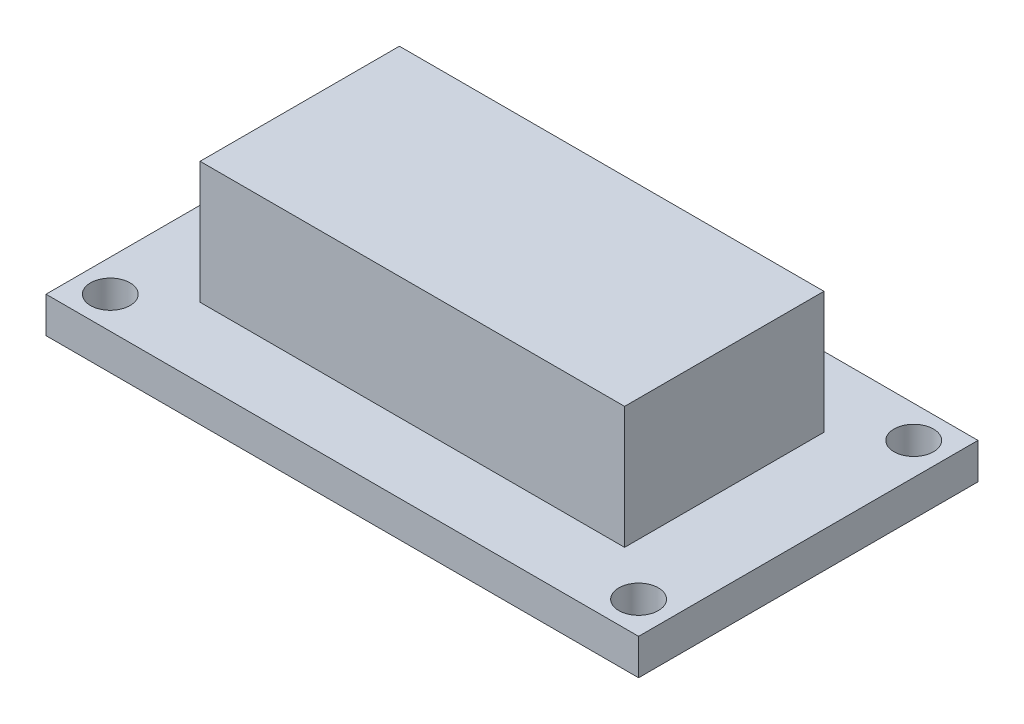
ISO-10303-21;
HEADER;
FILE_DESCRIPTION(('STEP AP214'),'2;1');
FILE_NAME('part.step','',(''),(''),'','','');
FILE_SCHEMA(('AUTOMOTIVE_DESIGN { 1 0 10303 214 1 1 1 1 }'));
ENDSEC;
DATA;
#1=APPLICATION_CONTEXT('core data for automotive mechanical design processes');
#2=APPLICATION_PROTOCOL_DEFINITION('international standard','automotive_design',2000,#1);
#3=PRODUCT_CONTEXT('',#1,'mechanical');
#4=PRODUCT('Part','Part','',(#3));
#5=PRODUCT_RELATED_PRODUCT_CATEGORY('part','',(#4));
#6=PRODUCT_DEFINITION_FORMATION('','',#4);
#7=PRODUCT_DEFINITION_CONTEXT('part definition',#1,'design');
#8=PRODUCT_DEFINITION('design','',#6,#7);
#9=PRODUCT_DEFINITION_SHAPE('','',#8);
#10=(LENGTH_UNIT() NAMED_UNIT(*) SI_UNIT(.MILLI.,.METRE.));
#11=(NAMED_UNIT(*) PLANE_ANGLE_UNIT() SI_UNIT($,.RADIAN.));
#12=(NAMED_UNIT(*) SI_UNIT($,.STERADIAN.) SOLID_ANGLE_UNIT());
#13=UNCERTAINTY_MEASURE_WITH_UNIT(LENGTH_MEASURE(1.E-05),#10,'distance_accuracy_value','');
#14=(GEOMETRIC_REPRESENTATION_CONTEXT(3) GLOBAL_UNCERTAINTY_ASSIGNED_CONTEXT((#13)) GLOBAL_UNIT_ASSIGNED_CONTEXT((#10,
#11,#12)) REPRESENTATION_CONTEXT('',''));
#15=CARTESIAN_POINT('',(0.,0.,0.));
#16=DIRECTION('',(0.,0.,1.));
#17=DIRECTION('',(1.,0.,0.));
#18=AXIS2_PLACEMENT_3D('',#15,#16,#17);
#19=CARTESIAN_POINT('',(0.,2.54,0.));
#20=DIRECTION('',(0.,-1.,0.));
#21=DIRECTION('',(0.,0.,-1.));
#22=AXIS2_PLACEMENT_3D('',#19,#20,#21);
#23=PLANE('',#22);
#24=CARTESIAN_POINT('',(18.6817,2.54,9.7282));
#25=DIRECTION('',(0.,1.,0.));
#26=DIRECTION('',(0.,0.,1.));
#27=AXIS2_PLACEMENT_3D('',#24,#25,#26);
#28=CIRCLE('',#27,1.397);
#29=CARTESIAN_POINT('',(18.6817,2.54,11.1252));
#30=VERTEX_POINT('',#29);
#31=EDGE_CURVE('E202',#30,#30,#28,.T.);
#32=ORIENTED_EDGE('',*,*,#31,.F.);
#33=EDGE_LOOP('',(#32));
#34=FACE_BOUND('',#33,.T.);
#35=CARTESIAN_POINT('',(-18.6817,2.54,-9.7282));
#36=DIRECTION('',(0.,1.,0.));
#37=DIRECTION('',(0.,0.,1.));
#38=AXIS2_PLACEMENT_3D('',#35,#36,#37);
#39=CIRCLE('',#38,1.397);
#40=CARTESIAN_POINT('',(-18.6817,2.54,-8.3312));
#41=VERTEX_POINT('',#40);
#42=EDGE_CURVE('E214',#41,#41,#39,.T.);
#43=ORIENTED_EDGE('',*,*,#42,.F.);
#44=EDGE_LOOP('',(#43));
#45=FACE_BOUND('',#44,.T.);
#46=DIRECTION('',(1.,0.,0.));
#47=VECTOR('',#46,1.);
#48=CARTESIAN_POINT('',(-20.955,2.54,-12.0015));
#49=LINE('',#48,#47);
#50=CARTESIAN_POINT('',(-20.955,2.54,-12.0015));
#51=VERTEX_POINT('',#50);
#52=CARTESIAN_POINT('',(20.955,2.54,-12.0015));
#53=VERTEX_POINT('',#52);
#54=EDGE_CURVE('E220',#51,#53,#49,.T.);
#55=ORIENTED_EDGE('',*,*,#54,.F.);
#56=DIRECTION('',(0.,0.,1.));
#57=VECTOR('',#56,1.);
#58=CARTESIAN_POINT('',(-20.955,2.54,-12.0015));
#59=LINE('',#58,#57);
#60=CARTESIAN_POINT('',(-20.955,2.54,12.0015));
#61=VERTEX_POINT('',#60);
#62=EDGE_CURVE('E229',#51,#61,#59,.T.);
#63=ORIENTED_EDGE('',*,*,#62,.T.);
#64=DIRECTION('',(1.,0.,0.));
#65=VECTOR('',#64,1.);
#66=CARTESIAN_POINT('',(-20.955,2.54,12.0015));
#67=LINE('',#66,#65);
#68=CARTESIAN_POINT('',(20.955,2.54,12.0015));
#69=VERTEX_POINT('',#68);
#70=EDGE_CURVE('E227',#61,#69,#67,.T.);
#71=ORIENTED_EDGE('',*,*,#70,.T.);
#72=DIRECTION('',(0.,0.,1.));
#73=VECTOR('',#72,1.);
#74=CARTESIAN_POINT('',(20.955,2.54,-12.0015));
#75=LINE('',#74,#73);
#76=EDGE_CURVE('E223',#53,#69,#75,.T.);
#77=ORIENTED_EDGE('',*,*,#76,.F.);
#78=EDGE_LOOP('',(#55,#63,#71,#77));
#79=FACE_BOUND('',#78,.T.);
#80=CARTESIAN_POINT('',(18.6817,2.54,-9.7282));
#81=DIRECTION('',(0.,-1.,0.));
#82=DIRECTION('',(0.,0.,-1.));
#83=AXIS2_PLACEMENT_3D('',#80,#81,#82);
#84=CIRCLE('',#83,1.397);
#85=CARTESIAN_POINT('',(18.6817,2.54,-11.1252));
#86=VERTEX_POINT('',#85);
#87=EDGE_CURVE('E208',#86,#86,#84,.T.);
#88=ORIENTED_EDGE('',*,*,#87,.T.);
#89=EDGE_LOOP('',(#88));
#90=FACE_BOUND('',#89,.T.);
#91=CARTESIAN_POINT('',(-18.6817,2.54,9.7282));
#92=DIRECTION('',(0.,-1.,0.));
#93=DIRECTION('',(0.,0.,-1.));
#94=AXIS2_PLACEMENT_3D('',#91,#92,#93);
#95=CIRCLE('',#94,1.397);
#96=CARTESIAN_POINT('',(-18.6817,2.54,8.3312));
#97=VERTEX_POINT('',#96);
#98=EDGE_CURVE('E193',#97,#97,#95,.T.);
#99=ORIENTED_EDGE('',*,*,#98,.T.);
#100=EDGE_LOOP('',(#99));
#101=FACE_BOUND('',#100,.T.);
#102=DIRECTION('',(0.,0.,-1.));
#103=VECTOR('',#102,1.);
#104=CARTESIAN_POINT('',(15.0114,2.54,-7.0485));
#105=LINE('',#104,#103);
#106=CARTESIAN_POINT('',(15.0114,2.54,7.0485));
#107=VERTEX_POINT('',#106);
#108=CARTESIAN_POINT('',(15.0114,2.54,-7.0485));
#109=VERTEX_POINT('',#108);
#110=EDGE_CURVE('E189',#107,#109,#105,.T.);
#111=ORIENTED_EDGE('',*,*,#110,.F.);
#112=DIRECTION('',(1.,0.,0.));
#113=VECTOR('',#112,1.);
#114=CARTESIAN_POINT('',(-15.0114,2.54,7.0485));
#115=LINE('',#114,#113);
#116=CARTESIAN_POINT('',(-15.0114,2.54,7.0485));
#117=VERTEX_POINT('',#116);
#118=EDGE_CURVE('E186',#117,#107,#115,.T.);
#119=ORIENTED_EDGE('',*,*,#118,.F.);
#120=DIRECTION('',(0.,0.,1.));
#121=VECTOR('',#120,1.);
#122=CARTESIAN_POINT('',(-15.0114,2.54,-7.0485));
#123=LINE('',#122,#121);
#124=CARTESIAN_POINT('',(-15.0114,2.54,-7.0485));
#125=VERTEX_POINT('',#124);
#126=EDGE_CURVE('E125',#125,#117,#123,.T.);
#127=ORIENTED_EDGE('',*,*,#126,.F.);
#128=DIRECTION('',(-1.,0.,0.));
#129=VECTOR('',#128,1.);
#130=CARTESIAN_POINT('',(-15.0114,2.54,-7.0485));
#131=LINE('',#130,#129);
#132=EDGE_CURVE('E120',#109,#125,#131,.T.);
#133=ORIENTED_EDGE('',*,*,#132,.F.);
#134=EDGE_LOOP('',(#111,#119,#127,#133));
#135=FACE_BOUND('',#134,.T.);
#136=ADVANCED_FACE('F103',(#34,#45,#79,#90,#101,#135),#23,.F.);
#137=CARTESIAN_POINT('',(0.,0.,0.));
#138=DIRECTION('',(0.,-1.,0.));
#139=DIRECTION('',(0.,0.,-1.));
#140=AXIS2_PLACEMENT_3D('',#137,#138,#139);
#141=PLANE('',#140);
#142=CARTESIAN_POINT('',(-18.6817,0.,9.7282));
#143=DIRECTION('',(0.,-1.,0.));
#144=DIRECTION('',(0.,0.,-1.));
#145=AXIS2_PLACEMENT_3D('',#142,#143,#144);
#146=CIRCLE('',#145,1.397);
#147=CARTESIAN_POINT('',(-18.6817,0.,8.3312));
#148=VERTEX_POINT('',#147);
#149=EDGE_CURVE('E190',#148,#148,#146,.T.);
#150=ORIENTED_EDGE('',*,*,#149,.F.);
#151=EDGE_LOOP('',(#150));
#152=FACE_BOUND('',#151,.T.);
#153=CARTESIAN_POINT('',(-18.6817,0.,-9.7282));
#154=DIRECTION('',(0.,1.,0.));
#155=DIRECTION('',(0.,0.,1.));
#156=AXIS2_PLACEMENT_3D('',#153,#154,#155);
#157=CIRCLE('',#156,1.397);
#158=CARTESIAN_POINT('',(-18.6817,0.,-8.3312));
#159=VERTEX_POINT('',#158);
#160=EDGE_CURVE('E211',#159,#159,#157,.T.);
#161=ORIENTED_EDGE('',*,*,#160,.T.);
#162=EDGE_LOOP('',(#161));
#163=FACE_BOUND('',#162,.T.);
#164=DIRECTION('',(1.,0.,0.));
#165=VECTOR('',#164,1.);
#166=CARTESIAN_POINT('',(-20.955,0.,-12.0015));
#167=LINE('',#166,#165);
#168=CARTESIAN_POINT('',(-20.955,0.,-12.0015));
#169=VERTEX_POINT('',#168);
#170=CARTESIAN_POINT('',(20.955,0.,-12.0015));
#171=VERTEX_POINT('',#170);
#172=EDGE_CURVE('E217',#169,#171,#167,.T.);
#173=ORIENTED_EDGE('',*,*,#172,.T.);
#174=DIRECTION('',(0.,0.,1.));
#175=VECTOR('',#174,1.);
#176=CARTESIAN_POINT('',(20.955,0.,-12.0015));
#177=LINE('',#176,#175);
#178=CARTESIAN_POINT('',(20.955,0.,12.0015));
#179=VERTEX_POINT('',#178);
#180=EDGE_CURVE('E233',#171,#179,#177,.T.);
#181=ORIENTED_EDGE('',*,*,#180,.T.);
#182=DIRECTION('',(1.,0.,0.));
#183=VECTOR('',#182,1.);
#184=CARTESIAN_POINT('',(-20.955,0.,12.0015));
#185=LINE('',#184,#183);
#186=CARTESIAN_POINT('',(-20.955,0.,12.0015));
#187=VERTEX_POINT('',#186);
#188=EDGE_CURVE('E236',#187,#179,#185,.T.);
#189=ORIENTED_EDGE('',*,*,#188,.F.);
#190=DIRECTION('',(0.,0.,1.));
#191=VECTOR('',#190,1.);
#192=CARTESIAN_POINT('',(-20.955,0.,-12.0015));
#193=LINE('',#192,#191);
#194=EDGE_CURVE('E224',#169,#187,#193,.T.);
#195=ORIENTED_EDGE('',*,*,#194,.F.);
#196=EDGE_LOOP('',(#173,#181,#189,#195));
#197=FACE_BOUND('',#196,.T.);
#198=CARTESIAN_POINT('',(18.6817,0.,-9.7282));
#199=DIRECTION('',(0.,-1.,0.));
#200=DIRECTION('',(0.,0.,-1.));
#201=AXIS2_PLACEMENT_3D('',#198,#199,#200);
#202=CIRCLE('',#201,1.397);
#203=CARTESIAN_POINT('',(18.6817,0.,-11.1252));
#204=VERTEX_POINT('',#203);
#205=EDGE_CURVE('E205',#204,#204,#202,.T.);
#206=ORIENTED_EDGE('',*,*,#205,.F.);
#207=EDGE_LOOP('',(#206));
#208=FACE_BOUND('',#207,.T.);
#209=CARTESIAN_POINT('',(18.6817,0.,9.7282));
#210=DIRECTION('',(0.,1.,0.));
#211=DIRECTION('',(0.,0.,1.));
#212=AXIS2_PLACEMENT_3D('',#209,#210,#211);
#213=CIRCLE('',#212,1.397);
#214=CARTESIAN_POINT('',(18.6817,0.,11.1252));
#215=VERTEX_POINT('',#214);
#216=EDGE_CURVE('E200',#215,#215,#213,.T.);
#217=ORIENTED_EDGE('',*,*,#216,.T.);
#218=EDGE_LOOP('',(#217));
#219=FACE_BOUND('',#218,.T.);
#220=ADVANCED_FACE('F253',(#152,#163,#197,#208,#219),#141,.T.);
#221=CARTESIAN_POINT('',(-20.955,2.54,-12.0015));
#222=DIRECTION('',(0.,0.,-1.));
#223=DIRECTION('',(-1.,0.,0.));
#224=AXIS2_PLACEMENT_3D('',#221,#222,#223);
#225=PLANE('',#224);
#226=ORIENTED_EDGE('',*,*,#172,.F.);
#227=DIRECTION('',(0.,-1.,0.));
#228=VECTOR('',#227,1.);
#229=CARTESIAN_POINT('',(-20.955,2.54,-12.0015));
#230=LINE('',#229,#228);
#231=EDGE_CURVE('E12',#51,#169,#230,.T.);
#232=ORIENTED_EDGE('',*,*,#231,.F.);
#233=ORIENTED_EDGE('',*,*,#54,.T.);
#234=DIRECTION('',(0.,-1.,0.));
#235=VECTOR('',#234,1.);
#236=CARTESIAN_POINT('',(20.955,2.54,-12.0015));
#237=LINE('',#236,#235);
#238=EDGE_CURVE('E107',#53,#171,#237,.T.);
#239=ORIENTED_EDGE('',*,*,#238,.T.);
#240=EDGE_LOOP('',(#226,#232,#233,#239));
#241=FACE_BOUND('',#240,.T.);
#242=ADVANCED_FACE('F105',(#241),#225,.T.);
#243=CARTESIAN_POINT('',(-20.955,2.54,-12.0015));
#244=DIRECTION('',(1.,0.,0.));
#245=DIRECTION('',(0.,0.,-1.));
#246=AXIS2_PLACEMENT_3D('',#243,#244,#245);
#247=PLANE('',#246);
#248=ORIENTED_EDGE('',*,*,#194,.T.);
#249=DIRECTION('',(0.,-1.,0.));
#250=VECTOR('',#249,1.);
#251=CARTESIAN_POINT('',(-20.955,2.54,12.0015));
#252=LINE('',#251,#250);
#253=EDGE_CURVE('E112',#61,#187,#252,.T.);
#254=ORIENTED_EDGE('',*,*,#253,.F.);
#255=ORIENTED_EDGE('',*,*,#62,.F.);
#256=ORIENTED_EDGE('',*,*,#231,.T.);
#257=EDGE_LOOP('',(#248,#254,#255,#256));
#258=FACE_BOUND('',#257,.T.);
#259=ADVANCED_FACE('F257',(#258),#247,.F.);
#260=CARTESIAN_POINT('',(-20.955,2.54,12.0015));
#261=DIRECTION('',(0.,0.,-1.));
#262=DIRECTION('',(-1.,0.,0.));
#263=AXIS2_PLACEMENT_3D('',#260,#261,#262);
#264=PLANE('',#263);
#265=ORIENTED_EDGE('',*,*,#188,.T.);
#266=DIRECTION('',(0.,-1.,0.));
#267=VECTOR('',#266,1.);
#268=CARTESIAN_POINT('',(20.955,2.54,12.0015));
#269=LINE('',#268,#267);
#270=EDGE_CURVE('E241',#69,#179,#269,.T.);
#271=ORIENTED_EDGE('',*,*,#270,.F.);
#272=ORIENTED_EDGE('',*,*,#70,.F.);
#273=ORIENTED_EDGE('',*,*,#253,.T.);
#274=EDGE_LOOP('',(#265,#271,#272,#273));
#275=FACE_BOUND('',#274,.T.);
#276=ADVANCED_FACE('F261',(#275),#264,.F.);
#277=CARTESIAN_POINT('',(20.955,2.54,-12.0015));
#278=DIRECTION('',(1.,0.,0.));
#279=DIRECTION('',(0.,0.,-1.));
#280=AXIS2_PLACEMENT_3D('',#277,#278,#279);
#281=PLANE('',#280);
#282=ORIENTED_EDGE('',*,*,#180,.F.);
#283=ORIENTED_EDGE('',*,*,#238,.F.);
#284=ORIENTED_EDGE('',*,*,#76,.T.);
#285=ORIENTED_EDGE('',*,*,#270,.T.);
#286=EDGE_LOOP('',(#282,#283,#284,#285));
#287=FACE_BOUND('',#286,.T.);
#288=ADVANCED_FACE('F249',(#287),#281,.T.);
#289=CARTESIAN_POINT('',(-18.6817,2.54,-9.7282));
#290=DIRECTION('',(0.,-1.,0.));
#291=DIRECTION('',(0.,0.,-1.));
#292=AXIS2_PLACEMENT_3D('',#289,#290,#291);
#293=CYLINDRICAL_SURFACE('',#292,1.397);
#294=ORIENTED_EDGE('',*,*,#42,.T.);
#295=EDGE_LOOP('',(#294));
#296=FACE_BOUND('',#295,.T.);
#297=ORIENTED_EDGE('',*,*,#160,.F.);
#298=EDGE_LOOP('',(#297));
#299=FACE_BOUND('',#298,.T.);
#300=ADVANCED_FACE('F308',(#296,#299),#293,.F.);
#301=CARTESIAN_POINT('',(18.6817,2.54,-9.7282));
#302=DIRECTION('',(0.,-1.,0.));
#303=DIRECTION('',(0.,0.,-1.));
#304=AXIS2_PLACEMENT_3D('',#301,#302,#303);
#305=CYLINDRICAL_SURFACE('',#304,1.397);
#306=ORIENTED_EDGE('',*,*,#87,.F.);
#307=EDGE_LOOP('',(#306));
#308=FACE_BOUND('',#307,.T.);
#309=ORIENTED_EDGE('',*,*,#205,.T.);
#310=EDGE_LOOP('',(#309));
#311=FACE_BOUND('',#310,.T.);
#312=ADVANCED_FACE('F304',(#308,#311),#305,.F.);
#313=CARTESIAN_POINT('',(18.6817,2.54,9.7282));
#314=DIRECTION('',(0.,-1.,0.));
#315=DIRECTION('',(0.,0.,-1.));
#316=AXIS2_PLACEMENT_3D('',#313,#314,#315);
#317=CYLINDRICAL_SURFACE('',#316,1.397);
#318=ORIENTED_EDGE('',*,*,#31,.T.);
#319=EDGE_LOOP('',(#318));
#320=FACE_BOUND('',#319,.T.);
#321=ORIENTED_EDGE('',*,*,#216,.F.);
#322=EDGE_LOOP('',(#321));
#323=FACE_BOUND('',#322,.T.);
#324=ADVANCED_FACE('F300',(#320,#323),#317,.F.);
#325=CARTESIAN_POINT('',(-18.6817,2.54,9.7282));
#326=DIRECTION('',(0.,-1.,0.));
#327=DIRECTION('',(0.,0.,-1.));
#328=AXIS2_PLACEMENT_3D('',#325,#326,#327);
#329=CYLINDRICAL_SURFACE('',#328,1.397);
#330=ORIENTED_EDGE('',*,*,#98,.F.);
#331=EDGE_LOOP('',(#330));
#332=FACE_BOUND('',#331,.T.);
#333=ORIENTED_EDGE('',*,*,#149,.T.);
#334=EDGE_LOOP('',(#333));
#335=FACE_BOUND('',#334,.T.);
#336=ADVANCED_FACE('F297',(#332,#335),#329,.F.);
#337=CARTESIAN_POINT('',(15.0114,11.176,-7.0485));
#338=DIRECTION('',(-1.,0.,0.));
#339=DIRECTION('',(0.,0.,1.));
#340=AXIS2_PLACEMENT_3D('',#337,#338,#339);
#341=PLANE('',#340);
#342=ORIENTED_EDGE('',*,*,#110,.T.);
#343=DIRECTION('',(0.,-1.,0.));
#344=VECTOR('',#343,1.);
#345=CARTESIAN_POINT('',(15.0114,11.176,-7.0485));
#346=LINE('',#345,#344);
#347=CARTESIAN_POINT('',(15.0114,11.176,-7.0485));
#348=VERTEX_POINT('',#347);
#349=EDGE_CURVE('E170',#348,#109,#346,.T.);
#350=ORIENTED_EDGE('',*,*,#349,.F.);
#351=DIRECTION('',(0.,0.,-1.));
#352=VECTOR('',#351,1.);
#353=CARTESIAN_POINT('',(15.0114,11.176,-7.0485));
#354=LINE('',#353,#352);
#355=CARTESIAN_POINT('',(15.0114,11.176,7.0485));
#356=VERTEX_POINT('',#355);
#357=EDGE_CURVE('E177',#356,#348,#354,.T.);
#358=ORIENTED_EDGE('',*,*,#357,.F.);
#359=DIRECTION('',(0.,-1.,0.));
#360=VECTOR('',#359,1.);
#361=CARTESIAN_POINT('',(15.0114,11.176,7.0485));
#362=LINE('',#361,#360);
#363=EDGE_CURVE('E275',#356,#107,#362,.T.);
#364=ORIENTED_EDGE('',*,*,#363,.T.);
#365=EDGE_LOOP('',(#342,#350,#358,#364));
#366=FACE_BOUND('',#365,.T.);
#367=ADVANCED_FACE('F188',(#366),#341,.F.);
#368=CARTESIAN_POINT('',(-15.0114,11.176,-7.0485));
#369=DIRECTION('',(0.,0.,1.));
#370=DIRECTION('',(1.,0.,0.));
#371=AXIS2_PLACEMENT_3D('',#368,#369,#370);
#372=PLANE('',#371);
#373=ORIENTED_EDGE('',*,*,#132,.T.);
#374=DIRECTION('',(0.,-1.,0.));
#375=VECTOR('',#374,1.);
#376=CARTESIAN_POINT('',(-15.0114,11.176,-7.0485));
#377=LINE('',#376,#375);
#378=CARTESIAN_POINT('',(-15.0114,11.176,-7.0485));
#379=VERTEX_POINT('',#378);
#380=EDGE_CURVE('E173',#379,#125,#377,.T.);
#381=ORIENTED_EDGE('',*,*,#380,.F.);
#382=DIRECTION('',(-1.,0.,0.));
#383=VECTOR('',#382,1.);
#384=CARTESIAN_POINT('',(-15.0114,11.176,-7.0485));
#385=LINE('',#384,#383);
#386=EDGE_CURVE('E166',#348,#379,#385,.T.);
#387=ORIENTED_EDGE('',*,*,#386,.F.);
#388=ORIENTED_EDGE('',*,*,#349,.T.);
#389=EDGE_LOOP('',(#373,#381,#387,#388));
#390=FACE_BOUND('',#389,.T.);
#391=ADVANCED_FACE('F168',(#390),#372,.F.);
#392=CARTESIAN_POINT('',(-15.0114,11.176,-7.0485));
#393=DIRECTION('',(1.,0.,0.));
#394=DIRECTION('',(0.,0.,-1.));
#395=AXIS2_PLACEMENT_3D('',#392,#393,#394);
#396=PLANE('',#395);
#397=ORIENTED_EDGE('',*,*,#126,.T.);
#398=DIRECTION('',(0.,-1.,0.));
#399=VECTOR('',#398,1.);
#400=CARTESIAN_POINT('',(-15.0114,11.176,7.0485));
#401=LINE('',#400,#399);
#402=CARTESIAN_POINT('',(-15.0114,11.176,7.0485));
#403=VERTEX_POINT('',#402);
#404=EDGE_CURVE('E195',#403,#117,#401,.T.);
#405=ORIENTED_EDGE('',*,*,#404,.F.);
#406=DIRECTION('',(0.,0.,1.));
#407=VECTOR('',#406,1.);
#408=CARTESIAN_POINT('',(-15.0114,11.176,-7.0485));
#409=LINE('',#408,#407);
#410=EDGE_CURVE('E176',#379,#403,#409,.T.);
#411=ORIENTED_EDGE('',*,*,#410,.F.);
#412=ORIENTED_EDGE('',*,*,#380,.T.);
#413=EDGE_LOOP('',(#397,#405,#411,#412));
#414=FACE_BOUND('',#413,.T.);
#415=ADVANCED_FACE('F284',(#414),#396,.F.);
#416=CARTESIAN_POINT('',(-15.0114,11.176,7.0485));
#417=DIRECTION('',(0.,0.,-1.));
#418=DIRECTION('',(-1.,0.,0.));
#419=AXIS2_PLACEMENT_3D('',#416,#417,#418);
#420=PLANE('',#419);
#421=ORIENTED_EDGE('',*,*,#118,.T.);
#422=ORIENTED_EDGE('',*,*,#363,.F.);
#423=DIRECTION('',(1.,0.,0.));
#424=VECTOR('',#423,1.);
#425=CARTESIAN_POINT('',(-15.0114,11.176,7.0485));
#426=LINE('',#425,#424);
#427=EDGE_CURVE('E182',#403,#356,#426,.T.);
#428=ORIENTED_EDGE('',*,*,#427,.F.);
#429=ORIENTED_EDGE('',*,*,#404,.T.);
#430=EDGE_LOOP('',(#421,#422,#428,#429));
#431=FACE_BOUND('',#430,.T.);
#432=ADVANCED_FACE('F274',(#431),#420,.F.);
#433=CARTESIAN_POINT('',(0.,11.176,0.));
#434=DIRECTION('',(0.,1.,0.));
#435=DIRECTION('',(0.,0.,1.));
#436=AXIS2_PLACEMENT_3D('',#433,#434,#435);
#437=PLANE('',#436);
#438=ORIENTED_EDGE('',*,*,#357,.T.);
#439=ORIENTED_EDGE('',*,*,#386,.T.);
#440=ORIENTED_EDGE('',*,*,#410,.T.);
#441=ORIENTED_EDGE('',*,*,#427,.T.);
#442=EDGE_LOOP('',(#438,#439,#440,#441));
#443=FACE_BOUND('',#442,.T.);
#444=ADVANCED_FACE('F180',(#443),#437,.T.);
#445=CLOSED_SHELL('',(#136,#220,#242,#259,#276,#288,#300,#312,#324,#336,#367,#391,#415,#432,#444));
#446=MANIFOLD_SOLID_BREP('B2',#445);
#447=ADVANCED_BREP_SHAPE_REPRESENTATION('',(#18,#446),#14);
#448=SHAPE_DEFINITION_REPRESENTATION(#9,#447);
ENDSEC;
END-ISO-10303-21;
